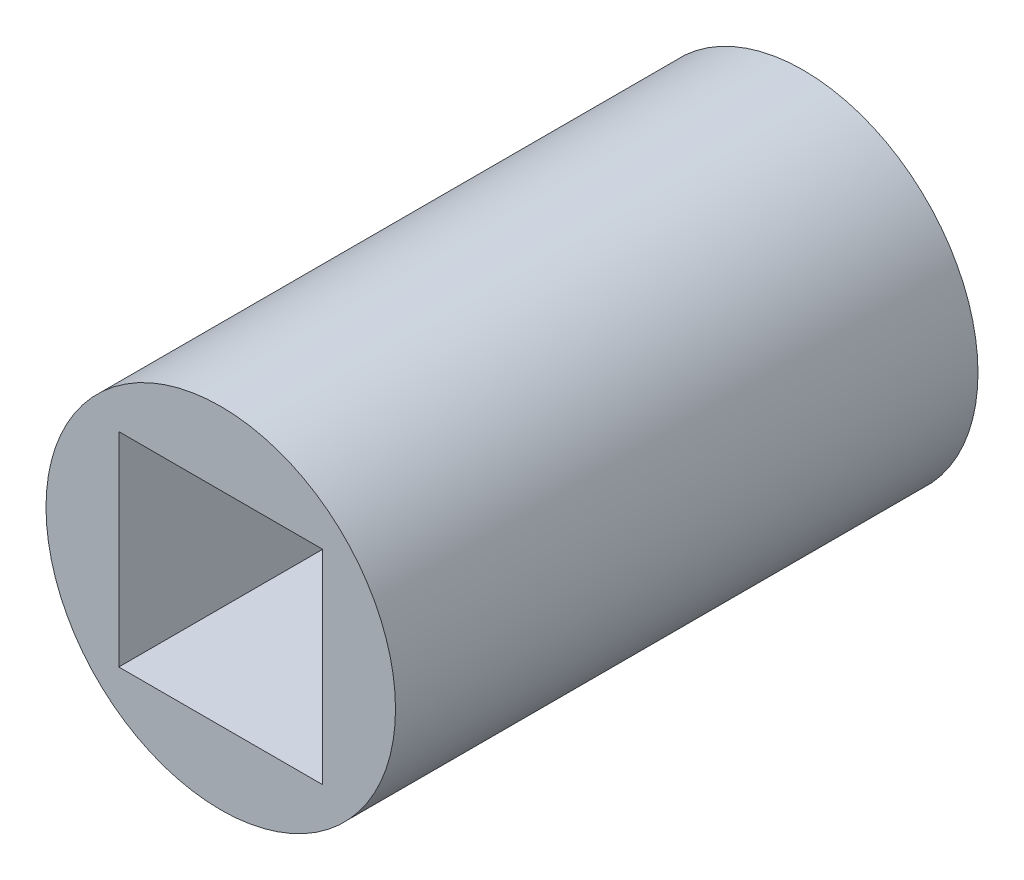
ISO-10303-21;
HEADER;
FILE_DESCRIPTION(('STEP AP214'),'2;1');
FILE_NAME('part.step','',(''),(''),'','','');
FILE_SCHEMA(('AUTOMOTIVE_DESIGN { 1 0 10303 214 1 1 1 1 }'));
ENDSEC;
DATA;
#1=APPLICATION_CONTEXT('core data for automotive mechanical design processes');
#2=APPLICATION_PROTOCOL_DEFINITION('international standard','automotive_design',2000,#1);
#3=PRODUCT_CONTEXT('',#1,'mechanical');
#4=PRODUCT('Part','Part','',(#3));
#5=PRODUCT_RELATED_PRODUCT_CATEGORY('part','',(#4));
#6=PRODUCT_DEFINITION_FORMATION('','',#4);
#7=PRODUCT_DEFINITION_CONTEXT('part definition',#1,'design');
#8=PRODUCT_DEFINITION('design','',#6,#7);
#9=PRODUCT_DEFINITION_SHAPE('','',#8);
#10=(LENGTH_UNIT() NAMED_UNIT(*) SI_UNIT(.MILLI.,.METRE.));
#11=(NAMED_UNIT(*) PLANE_ANGLE_UNIT() SI_UNIT($,.RADIAN.));
#12=(NAMED_UNIT(*) SI_UNIT($,.STERADIAN.) SOLID_ANGLE_UNIT());
#13=UNCERTAINTY_MEASURE_WITH_UNIT(LENGTH_MEASURE(1.E-05),#10,'distance_accuracy_value','');
#14=(GEOMETRIC_REPRESENTATION_CONTEXT(3) GLOBAL_UNCERTAINTY_ASSIGNED_CONTEXT((#13)) GLOBAL_UNIT_ASSIGNED_CONTEXT((#10,
#11,#12)) REPRESENTATION_CONTEXT('',''));
#15=CARTESIAN_POINT('',(0.,0.,0.));
#16=DIRECTION('',(0.,0.,1.));
#17=DIRECTION('',(1.,0.,0.));
#18=AXIS2_PLACEMENT_3D('',#15,#16,#17);
#19=CARTESIAN_POINT('',(17.5,17.5,100.));
#20=DIRECTION('',(0.,0.,1.));
#21=DIRECTION('',(1.,0.,0.));
#22=AXIS2_PLACEMENT_3D('',#19,#20,#21);
#23=PLANE('',#22);
#24=CARTESIAN_POINT('',(17.5,17.5,100.));
#25=DIRECTION('',(0.,0.,1.));
#26=DIRECTION('',(1.,0.,0.));
#27=AXIS2_PLACEMENT_3D('',#24,#25,#26);
#28=CIRCLE('',#27,30.);
#29=CARTESIAN_POINT('',(47.5,17.5,100.));
#30=VERTEX_POINT('',#29);
#31=EDGE_CURVE('E11',#30,#30,#28,.T.);
#32=ORIENTED_EDGE('',*,*,#31,.T.);
#33=EDGE_LOOP('',(#32));
#34=FACE_BOUND('',#33,.T.);
#35=DIRECTION('',(1.,0.,0.));
#36=VECTOR('',#35,1.);
#37=CARTESIAN_POINT('',(0.,0.,100.));
#38=LINE('',#37,#36);
#39=CARTESIAN_POINT('',(0.,0.,100.));
#40=VERTEX_POINT('',#39);
#41=CARTESIAN_POINT('',(35.,0.,100.));
#42=VERTEX_POINT('',#41);
#43=EDGE_CURVE('E84',#40,#42,#38,.T.);
#44=ORIENTED_EDGE('',*,*,#43,.F.);
#45=DIRECTION('',(0.,-1.,0.));
#46=VECTOR('',#45,1.);
#47=CARTESIAN_POINT('',(0.,0.,100.));
#48=LINE('',#47,#46);
#49=CARTESIAN_POINT('',(0.,35.,100.));
#50=VERTEX_POINT('',#49);
#51=EDGE_CURVE('E76',#50,#40,#48,.T.);
#52=ORIENTED_EDGE('',*,*,#51,.F.);
#53=DIRECTION('',(-1.,0.,0.));
#54=VECTOR('',#53,1.);
#55=CARTESIAN_POINT('',(0.,35.,100.));
#56=LINE('',#55,#54);
#57=CARTESIAN_POINT('',(35.,35.,100.));
#58=VERTEX_POINT('',#57);
#59=EDGE_CURVE('E97',#58,#50,#56,.T.);
#60=ORIENTED_EDGE('',*,*,#59,.F.);
#61=DIRECTION('',(0.,1.,0.));
#62=VECTOR('',#61,1.);
#63=CARTESIAN_POINT('',(35.,0.,100.));
#64=LINE('',#63,#62);
#65=EDGE_CURVE('E95',#42,#58,#64,.T.);
#66=ORIENTED_EDGE('',*,*,#65,.F.);
#67=EDGE_LOOP('',(#44,#52,#60,#66));
#68=FACE_BOUND('',#67,.T.);
#69=ADVANCED_FACE('F35',(#34,#68),#23,.T.);
#70=CARTESIAN_POINT('',(17.5,17.5,0.));
#71=DIRECTION('',(0.,0.,1.));
#72=DIRECTION('',(1.,0.,0.));
#73=AXIS2_PLACEMENT_3D('',#70,#71,#72);
#74=PLANE('',#73);
#75=CARTESIAN_POINT('',(17.5,17.5,0.));
#76=DIRECTION('',(0.,0.,1.));
#77=DIRECTION('',(1.,0.,0.));
#78=AXIS2_PLACEMENT_3D('',#75,#76,#77);
#79=CIRCLE('',#78,30.);
#80=CARTESIAN_POINT('',(47.5,17.5,0.));
#81=VERTEX_POINT('',#80);
#82=EDGE_CURVE('E39',#81,#81,#79,.T.);
#83=ORIENTED_EDGE('',*,*,#82,.F.);
#84=EDGE_LOOP('',(#83));
#85=FACE_BOUND('',#84,.T.);
#86=DIRECTION('',(0.,-1.,0.));
#87=VECTOR('',#86,1.);
#88=CARTESIAN_POINT('',(0.,0.,0.));
#89=LINE('',#88,#87);
#90=CARTESIAN_POINT('',(0.,35.,0.));
#91=VERTEX_POINT('',#90);
#92=CARTESIAN_POINT('',(0.,0.,0.));
#93=VERTEX_POINT('',#92);
#94=EDGE_CURVE('E58',#91,#93,#89,.T.);
#95=ORIENTED_EDGE('',*,*,#94,.T.);
#96=DIRECTION('',(1.,0.,0.));
#97=VECTOR('',#96,1.);
#98=CARTESIAN_POINT('',(0.,0.,0.));
#99=LINE('',#98,#97);
#100=CARTESIAN_POINT('',(35.,0.,0.));
#101=VERTEX_POINT('',#100);
#102=EDGE_CURVE('E91',#93,#101,#99,.T.);
#103=ORIENTED_EDGE('',*,*,#102,.T.);
#104=DIRECTION('',(0.,1.,0.));
#105=VECTOR('',#104,1.);
#106=CARTESIAN_POINT('',(35.,0.,0.));
#107=LINE('',#106,#105);
#108=CARTESIAN_POINT('',(35.,35.,0.));
#109=VERTEX_POINT('',#108);
#110=EDGE_CURVE('E103',#101,#109,#107,.T.);
#111=ORIENTED_EDGE('',*,*,#110,.T.);
#112=DIRECTION('',(-1.,0.,0.));
#113=VECTOR('',#112,1.);
#114=CARTESIAN_POINT('',(0.,35.,0.));
#115=LINE('',#114,#113);
#116=EDGE_CURVE('E85',#109,#91,#115,.T.);
#117=ORIENTED_EDGE('',*,*,#116,.T.);
#118=EDGE_LOOP('',(#95,#103,#111,#117));
#119=FACE_BOUND('',#118,.T.);
#120=ADVANCED_FACE('F114',(#85,#119),#74,.F.);
#121=CARTESIAN_POINT('',(17.5,17.5,100.));
#122=DIRECTION('',(0.,0.,-1.));
#123=DIRECTION('',(-1.,0.,0.));
#124=AXIS2_PLACEMENT_3D('',#121,#122,#123);
#125=CYLINDRICAL_SURFACE('',#124,30.);
#126=ORIENTED_EDGE('',*,*,#31,.F.);
#127=EDGE_LOOP('',(#126));
#128=FACE_BOUND('',#127,.T.);
#129=ORIENTED_EDGE('',*,*,#82,.T.);
#130=EDGE_LOOP('',(#129));
#131=FACE_BOUND('',#130,.T.);
#132=ADVANCED_FACE('F37',(#128,#131),#125,.T.);
#133=CARTESIAN_POINT('',(0.,0.,100.));
#134=DIRECTION('',(1.,0.,0.));
#135=DIRECTION('',(0.,1.,0.));
#136=AXIS2_PLACEMENT_3D('',#133,#134,#135);
#137=PLANE('',#136);
#138=ORIENTED_EDGE('',*,*,#94,.F.);
#139=DIRECTION('',(0.,0.,-1.));
#140=VECTOR('',#139,1.);
#141=CARTESIAN_POINT('',(0.,35.,100.));
#142=LINE('',#141,#140);
#143=EDGE_CURVE('E80',#50,#91,#142,.T.);
#144=ORIENTED_EDGE('',*,*,#143,.F.);
#145=ORIENTED_EDGE('',*,*,#51,.T.);
#146=DIRECTION('',(0.,0.,-1.));
#147=VECTOR('',#146,1.);
#148=CARTESIAN_POINT('',(0.,0.,100.));
#149=LINE('',#148,#147);
#150=EDGE_CURVE('E79',#40,#93,#149,.T.);
#151=ORIENTED_EDGE('',*,*,#150,.T.);
#152=EDGE_LOOP('',(#138,#144,#145,#151));
#153=FACE_BOUND('',#152,.T.);
#154=ADVANCED_FACE('F78',(#153),#137,.T.);
#155=CARTESIAN_POINT('',(0.,0.,100.));
#156=DIRECTION('',(0.,1.,0.));
#157=DIRECTION('',(0.,0.,1.));
#158=AXIS2_PLACEMENT_3D('',#155,#156,#157);
#159=PLANE('',#158);
#160=ORIENTED_EDGE('',*,*,#102,.F.);
#161=ORIENTED_EDGE('',*,*,#150,.F.);
#162=ORIENTED_EDGE('',*,*,#43,.T.);
#163=DIRECTION('',(0.,0.,-1.));
#164=VECTOR('',#163,1.);
#165=CARTESIAN_POINT('',(35.,0.,100.));
#166=LINE('',#165,#164);
#167=EDGE_CURVE('E92',#42,#101,#166,.T.);
#168=ORIENTED_EDGE('',*,*,#167,.T.);
#169=EDGE_LOOP('',(#160,#161,#162,#168));
#170=FACE_BOUND('',#169,.T.);
#171=ADVANCED_FACE('F88',(#170),#159,.T.);
#172=CARTESIAN_POINT('',(35.,0.,100.));
#173=DIRECTION('',(-1.,0.,0.));
#174=DIRECTION('',(0.,-1.,0.));
#175=AXIS2_PLACEMENT_3D('',#172,#173,#174);
#176=PLANE('',#175);
#177=ORIENTED_EDGE('',*,*,#110,.F.);
#178=ORIENTED_EDGE('',*,*,#167,.F.);
#179=ORIENTED_EDGE('',*,*,#65,.T.);
#180=DIRECTION('',(0.,0.,-1.));
#181=VECTOR('',#180,1.);
#182=CARTESIAN_POINT('',(35.,35.,100.));
#183=LINE('',#182,#181);
#184=EDGE_CURVE('E50',#58,#109,#183,.T.);
#185=ORIENTED_EDGE('',*,*,#184,.T.);
#186=EDGE_LOOP('',(#177,#178,#179,#185));
#187=FACE_BOUND('',#186,.T.);
#188=ADVANCED_FACE('F112',(#187),#176,.T.);
#189=CARTESIAN_POINT('',(0.,35.,100.));
#190=DIRECTION('',(0.,-1.,0.));
#191=DIRECTION('',(0.,0.,-1.));
#192=AXIS2_PLACEMENT_3D('',#189,#190,#191);
#193=PLANE('',#192);
#194=ORIENTED_EDGE('',*,*,#116,.F.);
#195=ORIENTED_EDGE('',*,*,#184,.F.);
#196=ORIENTED_EDGE('',*,*,#59,.T.);
#197=ORIENTED_EDGE('',*,*,#143,.T.);
#198=EDGE_LOOP('',(#194,#195,#196,#197));
#199=FACE_BOUND('',#198,.T.);
#200=ADVANCED_FACE('F115',(#199),#193,.T.);
#201=CLOSED_SHELL('',(#69,#120,#132,#154,#171,#188,#200));
#202=MANIFOLD_SOLID_BREP('B2',#201);
#203=ADVANCED_BREP_SHAPE_REPRESENTATION('',(#18,#202),#14);
#204=SHAPE_DEFINITION_REPRESENTATION(#9,#203);
ENDSEC;
END-ISO-10303-21;
